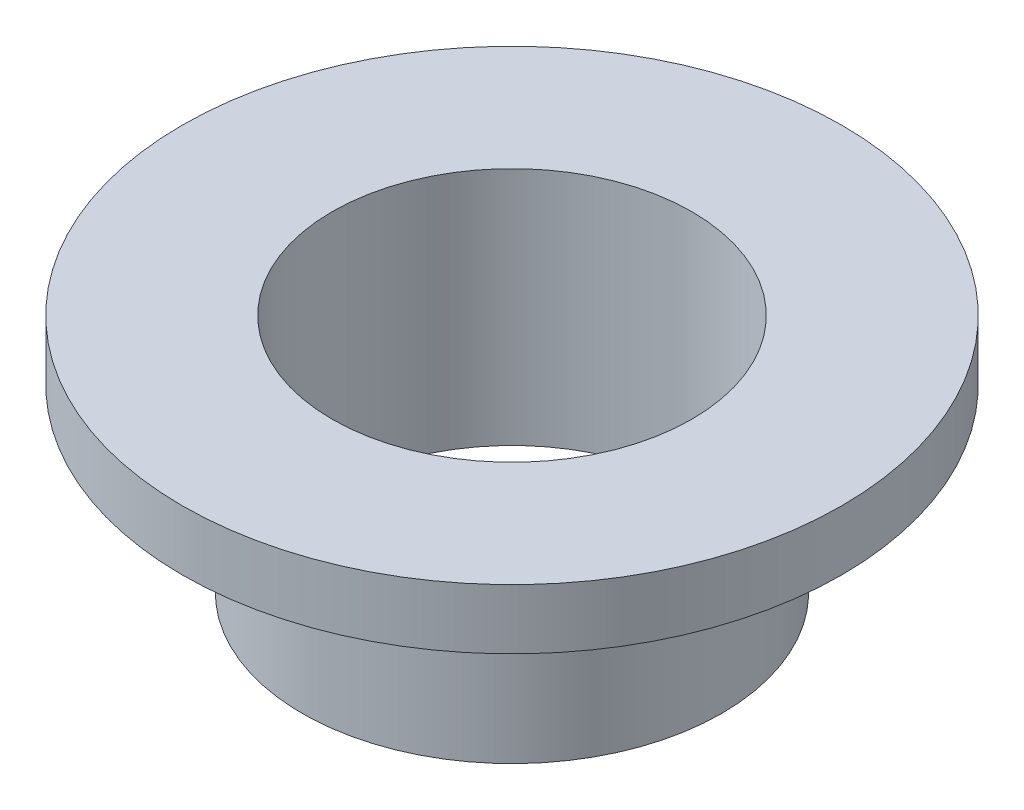
ISO-10303-21;
HEADER;
FILE_DESCRIPTION(('STEP AP214'),'2;1');
FILE_NAME('part.step','',(''),(''),'','','');
FILE_SCHEMA(('AUTOMOTIVE_DESIGN { 1 0 10303 214 1 1 1 1 }'));
ENDSEC;
DATA;
#1=APPLICATION_CONTEXT('core data for automotive mechanical design processes');
#2=APPLICATION_PROTOCOL_DEFINITION('international standard','automotive_design',2000,#1);
#3=PRODUCT_CONTEXT('',#1,'mechanical');
#4=PRODUCT('Part','Part','',(#3));
#5=PRODUCT_RELATED_PRODUCT_CATEGORY('part','',(#4));
#6=PRODUCT_DEFINITION_FORMATION('','',#4);
#7=PRODUCT_DEFINITION_CONTEXT('part definition',#1,'design');
#8=PRODUCT_DEFINITION('design','',#6,#7);
#9=PRODUCT_DEFINITION_SHAPE('','',#8);
#10=(LENGTH_UNIT() NAMED_UNIT(*) SI_UNIT(.MILLI.,.METRE.));
#11=(NAMED_UNIT(*) PLANE_ANGLE_UNIT() SI_UNIT($,.RADIAN.));
#12=(NAMED_UNIT(*) SI_UNIT($,.STERADIAN.) SOLID_ANGLE_UNIT());
#13=UNCERTAINTY_MEASURE_WITH_UNIT(LENGTH_MEASURE(1.E-05),#10,'distance_accuracy_value','');
#14=(GEOMETRIC_REPRESENTATION_CONTEXT(3) GLOBAL_UNCERTAINTY_ASSIGNED_CONTEXT((#13)) GLOBAL_UNIT_ASSIGNED_CONTEXT((#10,
#11,#12)) REPRESENTATION_CONTEXT('',''));
#15=CARTESIAN_POINT('',(0.,0.,0.));
#16=DIRECTION('',(0.,0.,1.));
#17=DIRECTION('',(1.,0.,0.));
#18=AXIS2_PLACEMENT_3D('',#15,#16,#17);
#19=CARTESIAN_POINT('',(0.,0.,0.));
#20=DIRECTION('',(0.,1.,0.));
#21=DIRECTION('',(-1.,0.,0.));
#22=AXIS2_PLACEMENT_3D('',#19,#20,#21);
#23=CYLINDRICAL_SURFACE('',#22,5.5);
#24=CARTESIAN_POINT('',(0.,0.,0.));
#25=DIRECTION('',(0.,1.,0.));
#26=DIRECTION('',(-1.,0.,0.));
#27=AXIS2_PLACEMENT_3D('',#24,#25,#26);
#28=CIRCLE('',#27,5.5);
#29=CARTESIAN_POINT('',(-5.5,0.,0.));
#30=VERTEX_POINT('',#29);
#31=EDGE_CURVE('E64',#30,#30,#28,.T.);
#32=ORIENTED_EDGE('',*,*,#31,.F.);
#33=EDGE_LOOP('',(#32));
#34=FACE_BOUND('',#33,.T.);
#35=CARTESIAN_POINT('',(0.,-1.,0.));
#36=DIRECTION('',(0.,1.,0.));
#37=DIRECTION('',(-1.,0.,0.));
#38=AXIS2_PLACEMENT_3D('',#35,#36,#37);
#39=CIRCLE('',#38,5.5);
#40=CARTESIAN_POINT('',(-5.5,-1.,0.));
#41=VERTEX_POINT('',#40);
#42=EDGE_CURVE('E10',#41,#41,#39,.T.);
#43=ORIENTED_EDGE('',*,*,#42,.T.);
#44=EDGE_LOOP('',(#43));
#45=FACE_BOUND('',#44,.T.);
#46=ADVANCED_FACE('F37',(#34,#45),#23,.T.);
#47=CARTESIAN_POINT('',(5.5,-1.,0.));
#48=DIRECTION('',(0.,1.,0.));
#49=DIRECTION('',(-1.,0.,0.));
#50=AXIS2_PLACEMENT_3D('',#47,#48,#49);
#51=PLANE('',#50);
#52=ORIENTED_EDGE('',*,*,#42,.F.);
#53=EDGE_LOOP('',(#52));
#54=FACE_BOUND('',#53,.T.);
#55=CARTESIAN_POINT('',(0.,-1.,0.));
#56=DIRECTION('',(0.,1.,0.));
#57=DIRECTION('',(-1.,0.,0.));
#58=AXIS2_PLACEMENT_3D('',#55,#56,#57);
#59=CIRCLE('',#58,3.5);
#60=CARTESIAN_POINT('',(-3.5,-1.,0.));
#61=VERTEX_POINT('',#60);
#62=EDGE_CURVE('E44',#61,#61,#59,.T.);
#63=ORIENTED_EDGE('',*,*,#62,.T.);
#64=EDGE_LOOP('',(#63));
#65=FACE_BOUND('',#64,.T.);
#66=ADVANCED_FACE('F72',(#54,#65),#51,.F.);
#67=CARTESIAN_POINT('',(0.,0.,0.));
#68=DIRECTION('',(0.,1.,0.));
#69=DIRECTION('',(-1.,0.,0.));
#70=AXIS2_PLACEMENT_3D('',#67,#68,#69);
#71=CYLINDRICAL_SURFACE('',#70,3.5);
#72=ORIENTED_EDGE('',*,*,#62,.F.);
#73=EDGE_LOOP('',(#72));
#74=FACE_BOUND('',#73,.T.);
#75=CARTESIAN_POINT('',(0.,-4.,0.));
#76=DIRECTION('',(0.,1.,0.));
#77=DIRECTION('',(-1.,0.,0.));
#78=AXIS2_PLACEMENT_3D('',#75,#76,#77);
#79=CIRCLE('',#78,3.5);
#80=CARTESIAN_POINT('',(-3.5,-4.,0.));
#81=VERTEX_POINT('',#80);
#82=EDGE_CURVE('E49',#81,#81,#79,.T.);
#83=ORIENTED_EDGE('',*,*,#82,.T.);
#84=EDGE_LOOP('',(#83));
#85=FACE_BOUND('',#84,.T.);
#86=ADVANCED_FACE('F76',(#74,#85),#71,.T.);
#87=CARTESIAN_POINT('',(3.5,-4.,0.));
#88=DIRECTION('',(0.,1.,0.));
#89=DIRECTION('',(-1.,0.,0.));
#90=AXIS2_PLACEMENT_3D('',#87,#88,#89);
#91=PLANE('',#90);
#92=ORIENTED_EDGE('',*,*,#82,.F.);
#93=EDGE_LOOP('',(#92));
#94=FACE_BOUND('',#93,.T.);
#95=CARTESIAN_POINT('',(0.,-4.,0.));
#96=DIRECTION('',(0.,1.,0.));
#97=DIRECTION('',(-1.,0.,0.));
#98=AXIS2_PLACEMENT_3D('',#95,#96,#97);
#99=CIRCLE('',#98,3.);
#100=CARTESIAN_POINT('',(-3.,-4.,0.));
#101=VERTEX_POINT('',#100);
#102=EDGE_CURVE('E54',#101,#101,#99,.T.);
#103=ORIENTED_EDGE('',*,*,#102,.T.);
#104=EDGE_LOOP('',(#103));
#105=FACE_BOUND('',#104,.T.);
#106=ADVANCED_FACE('F81',(#94,#105),#91,.F.);
#107=CARTESIAN_POINT('',(0.,0.,0.));
#108=DIRECTION('',(0.,1.,0.));
#109=DIRECTION('',(-1.,0.,0.));
#110=AXIS2_PLACEMENT_3D('',#107,#108,#109);
#111=CYLINDRICAL_SURFACE('',#110,3.);
#112=ORIENTED_EDGE('',*,*,#102,.F.);
#113=EDGE_LOOP('',(#112));
#114=FACE_BOUND('',#113,.T.);
#115=CARTESIAN_POINT('',(0.,0.,0.));
#116=DIRECTION('',(0.,1.,0.));
#117=DIRECTION('',(-1.,0.,0.));
#118=AXIS2_PLACEMENT_3D('',#115,#116,#117);
#119=CIRCLE('',#118,3.);
#120=CARTESIAN_POINT('',(-3.,0.,0.));
#121=VERTEX_POINT('',#120);
#122=EDGE_CURVE('E60',#121,#121,#119,.T.);
#123=ORIENTED_EDGE('',*,*,#122,.T.);
#124=EDGE_LOOP('',(#123));
#125=FACE_BOUND('',#124,.T.);
#126=ADVANCED_FACE('F87',(#114,#125),#111,.F.);
#127=CARTESIAN_POINT('',(3.,0.,0.));
#128=DIRECTION('',(0.,-1.,0.));
#129=DIRECTION('',(1.,0.,0.));
#130=AXIS2_PLACEMENT_3D('',#127,#128,#129);
#131=PLANE('',#130);
#132=ORIENTED_EDGE('',*,*,#122,.F.);
#133=EDGE_LOOP('',(#132));
#134=FACE_BOUND('',#133,.T.);
#135=ORIENTED_EDGE('',*,*,#31,.T.);
#136=EDGE_LOOP('',(#135));
#137=FACE_BOUND('',#136,.T.);
#138=ADVANCED_FACE('F69',(#134,#137),#131,.F.);
#139=CLOSED_SHELL('',(#46,#66,#86,#106,#126,#138));
#140=MANIFOLD_SOLID_BREP('B2',#139);
#141=ADVANCED_BREP_SHAPE_REPRESENTATION('',(#18,#140),#14);
#142=SHAPE_DEFINITION_REPRESENTATION(#9,#141);
ENDSEC;
END-ISO-10303-21;
